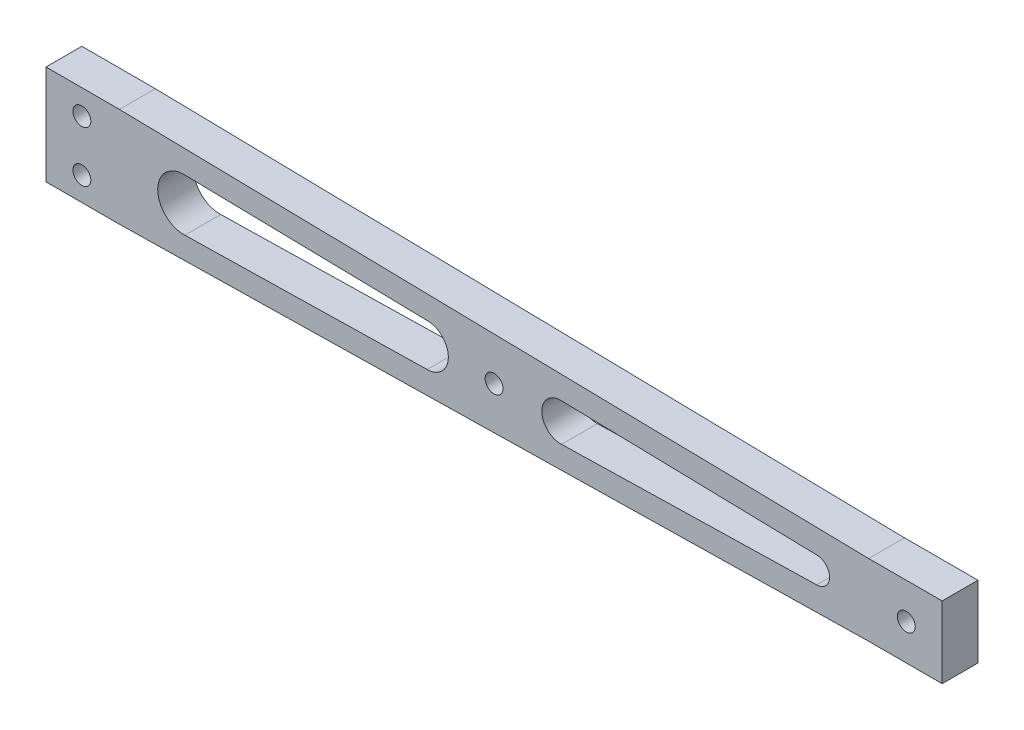
ISO-10303-21;
HEADER;
FILE_DESCRIPTION(('STEP AP214'),'2;1');
FILE_NAME('part.step','',(''),(''),'','','');
FILE_SCHEMA(('AUTOMOTIVE_DESIGN { 1 0 10303 214 1 1 1 1 }'));
ENDSEC;
DATA;
#1=APPLICATION_CONTEXT('core data for automotive mechanical design processes');
#2=APPLICATION_PROTOCOL_DEFINITION('international standard','automotive_design',2000,#1);
#3=PRODUCT_CONTEXT('',#1,'mechanical');
#4=PRODUCT('Part','Part','',(#3));
#5=PRODUCT_RELATED_PRODUCT_CATEGORY('part','',(#4));
#6=PRODUCT_DEFINITION_FORMATION('','',#4);
#7=PRODUCT_DEFINITION_CONTEXT('part definition',#1,'design');
#8=PRODUCT_DEFINITION('design','',#6,#7);
#9=PRODUCT_DEFINITION_SHAPE('','',#8);
#10=(LENGTH_UNIT() NAMED_UNIT(*) SI_UNIT(.MILLI.,.METRE.));
#11=(NAMED_UNIT(*) PLANE_ANGLE_UNIT() SI_UNIT($,.RADIAN.));
#12=(NAMED_UNIT(*) SI_UNIT($,.STERADIAN.) SOLID_ANGLE_UNIT());
#13=UNCERTAINTY_MEASURE_WITH_UNIT(LENGTH_MEASURE(1.E-05),#10,'distance_accuracy_value','');
#14=(GEOMETRIC_REPRESENTATION_CONTEXT(3) GLOBAL_UNCERTAINTY_ASSIGNED_CONTEXT((#13)) GLOBAL_UNIT_ASSIGNED_CONTEXT((#10,
#11,#12)) REPRESENTATION_CONTEXT('',''));
#15=CARTESIAN_POINT('',(0.,0.,0.));
#16=DIRECTION('',(0.,0.,1.));
#17=DIRECTION('',(1.,0.,0.));
#18=AXIS2_PLACEMENT_3D('',#15,#16,#17);
#19=CARTESIAN_POINT('',(0.,0.,10.));
#20=DIRECTION('',(0.,0.,1.));
#21=DIRECTION('',(1.,0.,0.));
#22=AXIS2_PLACEMENT_3D('',#19,#20,#21);
#23=PLANE('',#22);
#24=CARTESIAN_POINT('',(10.0736692158936,2.87880970195048,10.));
#25=DIRECTION('',(0.,0.,1.));
#26=DIRECTION('',(1.,0.,0.));
#27=AXIS2_PLACEMENT_3D('',#24,#25,#26);
#28=CIRCLE('',#27,2.5);
#29=CARTESIAN_POINT('',(12.5736692158936,2.87880970195048,10.));
#30=VERTEX_POINT('',#29);
#31=EDGE_CURVE('E255',#30,#30,#28,.T.);
#32=ORIENTED_EDGE('',*,*,#31,.F.);
#33=EDGE_LOOP('',(#32));
#34=FACE_BOUND('',#33,.T.);
#35=CARTESIAN_POINT('',(10.0736692158936,17.1211902980495,10.));
#36=DIRECTION('',(0.,0.,1.));
#37=DIRECTION('',(1.,0.,0.));
#38=AXIS2_PLACEMENT_3D('',#35,#36,#37);
#39=CIRCLE('',#38,2.50000000000001);
#40=CARTESIAN_POINT('',(12.5736692158936,17.1211902980495,10.));
#41=VERTEX_POINT('',#40);
#42=EDGE_CURVE('E271',#41,#41,#39,.T.);
#43=ORIENTED_EDGE('',*,*,#42,.F.);
#44=EDGE_LOOP('',(#43));
#45=FACE_BOUND('',#44,.T.);
#46=DIRECTION('',(-1.,0.,0.));
#47=VECTOR('',#46,1.);
#48=CARTESIAN_POINT('',(250.073669215894,20.,10.));
#49=LINE('',#48,#47);
#50=CARTESIAN_POINT('',(250.073669215894,20.,10.));
#51=VERTEX_POINT('',#50);
#52=CARTESIAN_POINT('',(229.573669215894,20.,10.));
#53=VERTEX_POINT('',#52);
#54=EDGE_CURVE('E279',#51,#53,#49,.T.);
#55=ORIENTED_EDGE('',*,*,#54,.T.);
#56=DIRECTION('',(-0.99981690430808,0.0191352517570925,0.));
#57=VECTOR('',#56,1.);
#58=CARTESIAN_POINT('',(229.573669215894,20.,10.));
#59=LINE('',#58,#57);
#60=CARTESIAN_POINT('',(20.5736692158936,24.,10.));
#61=VERTEX_POINT('',#60);
#62=EDGE_CURVE('E283',#53,#61,#59,.T.);
#63=ORIENTED_EDGE('',*,*,#62,.T.);
#64=DIRECTION('',(-1.,0.,0.));
#65=VECTOR('',#64,1.);
#66=CARTESIAN_POINT('',(0.0736692158935792,24.,10.));
#67=LINE('',#66,#65);
#68=CARTESIAN_POINT('',(0.0736692158935792,24.,10.));
#69=VERTEX_POINT('',#68);
#70=EDGE_CURVE('E287',#61,#69,#67,.T.);
#71=ORIENTED_EDGE('',*,*,#70,.T.);
#72=DIRECTION('',(0.,-1.,0.));
#73=VECTOR('',#72,1.);
#74=CARTESIAN_POINT('',(0.0736692158935792,24.,10.));
#75=LINE('',#74,#73);
#76=CARTESIAN_POINT('',(0.0736692158935792,-3.75761940390097,10.));
#77=VERTEX_POINT('',#76);
#78=EDGE_CURVE('E290',#69,#77,#75,.T.);
#79=ORIENTED_EDGE('',*,*,#78,.T.);
#80=DIRECTION('',(1.,0.,0.));
#81=VECTOR('',#80,1.);
#82=CARTESIAN_POINT('',(0.0736692158935792,-3.75761940390097,10.));
#83=LINE('',#82,#81);
#84=CARTESIAN_POINT('',(20.5736692158936,-3.75761940390097,10.));
#85=VERTEX_POINT('',#84);
#86=EDGE_CURVE('E293',#77,#85,#83,.T.);
#87=ORIENTED_EDGE('',*,*,#86,.T.);
#88=DIRECTION('',(0.999838416228975,0.0179761350889359,0.));
#89=VECTOR('',#88,1.);
#90=CARTESIAN_POINT('',(229.573669215894,0.,10.));
#91=LINE('',#90,#89);
#92=CARTESIAN_POINT('',(229.573669215894,0.,10.));
#93=VERTEX_POINT('',#92);
#94=EDGE_CURVE('E296',#85,#93,#91,.T.);
#95=ORIENTED_EDGE('',*,*,#94,.T.);
#96=DIRECTION('',(1.,0.,0.));
#97=VECTOR('',#96,1.);
#98=CARTESIAN_POINT('',(250.073669215894,0.,10.));
#99=LINE('',#98,#97);
#100=CARTESIAN_POINT('',(250.073669215894,0.,10.));
#101=VERTEX_POINT('',#100);
#102=EDGE_CURVE('E299',#93,#101,#99,.T.);
#103=ORIENTED_EDGE('',*,*,#102,.T.);
#104=DIRECTION('',(0.,1.,0.));
#105=VECTOR('',#104,1.);
#106=CARTESIAN_POINT('',(250.073669215894,0.,10.));
#107=LINE('',#106,#105);
#108=EDGE_CURVE('E302',#101,#51,#107,.T.);
#109=ORIENTED_EDGE('',*,*,#108,.T.);
#110=EDGE_LOOP('',(#55,#63,#71,#79,#87,#95,#103,#109));
#111=FACE_BOUND('',#110,.T.);
#112=CARTESIAN_POINT('',(240.073669215894,9.99999999999999,10.));
#113=DIRECTION('',(0.,0.,1.));
#114=DIRECTION('',(1.,0.,0.));
#115=AXIS2_PLACEMENT_3D('',#112,#113,#114);
#116=CIRCLE('',#115,2.49999999999997);
#117=CARTESIAN_POINT('',(242.573669215894,9.99999999999999,10.));
#118=VERTEX_POINT('',#117);
#119=EDGE_CURVE('E263',#118,#118,#116,.T.);
#120=ORIENTED_EDGE('',*,*,#119,.F.);
#121=EDGE_LOOP('',(#120));
#122=FACE_BOUND('',#121,.T.);
#123=CARTESIAN_POINT('',(125.073669215894,9.99999999999999,10.));
#124=DIRECTION('',(0.,0.,1.));
#125=DIRECTION('',(1.,0.,0.));
#126=AXIS2_PLACEMENT_3D('',#123,#124,#125);
#127=CIRCLE('',#126,2.5);
#128=CARTESIAN_POINT('',(127.573669215894,9.99999999999999,10.));
#129=VERTEX_POINT('',#128);
#130=EDGE_CURVE('E247',#129,#129,#127,.T.);
#131=ORIENTED_EDGE('',*,*,#130,.F.);
#132=EDGE_LOOP('',(#131));
#133=FACE_BOUND('',#132,.T.);
#134=DIRECTION('',(-0.999735231647633,0.0230101412958051,0.));
#135=VECTOR('',#134,1.);
#136=CARTESIAN_POINT('',(215.057391590828,13.6211902980495,10.));
#137=LINE('',#136,#135);
#138=CARTESIAN_POINT('',(215.057391590828,13.6211902980495,10.));
#139=VERTEX_POINT('',#138);
#140=CARTESIAN_POINT('',(143.897703928752,15.2590184107701,10.));
#141=VERTEX_POINT('',#140);
#142=EDGE_CURVE('E207',#139,#141,#137,.T.);
#143=ORIENTED_EDGE('',*,*,#142,.F.);
#144=CARTESIAN_POINT('',(215.057391590828,9.99999999999999,10.));
#145=DIRECTION('',(0.,0.,1.));
#146=DIRECTION('',(1.,0.,0.));
#147=AXIS2_PLACEMENT_3D('',#144,#145,#146);
#148=CIRCLE('',#147,3.62119029804952);
#149=CARTESIAN_POINT('',(215.057391590828,6.37880970195047,10.));
#150=VERTEX_POINT('',#149);
#151=EDGE_CURVE('E204',#150,#139,#148,.T.);
#152=ORIENTED_EDGE('',*,*,#151,.F.);
#153=DIRECTION('',(0.999735231647633,0.0230101412958052,0.));
#154=VECTOR('',#153,1.);
#155=CARTESIAN_POINT('',(143.897703928752,4.74098158922988,10.));
#156=LINE('',#155,#154);
#157=CARTESIAN_POINT('',(143.897703928752,4.74098158922988,10.));
#158=VERTEX_POINT('',#157);
#159=EDGE_CURVE('E215',#158,#150,#156,.T.);
#160=ORIENTED_EDGE('',*,*,#159,.F.);
#161=CARTESIAN_POINT('',(143.655490006606,9.99999999999999,10.));
#162=DIRECTION('',(0.,0.,1.));
#163=DIRECTION('',(1.,0.,0.));
#164=AXIS2_PLACEMENT_3D('',#161,#162,#163);
#165=CIRCLE('',#164,5.26459326338704);
#166=EDGE_CURVE('E211',#141,#158,#165,.T.);
#167=ORIENTED_EDGE('',*,*,#166,.F.);
#168=EDGE_LOOP('',(#143,#152,#160,#167));
#169=FACE_BOUND('',#168,.T.);
#170=DIRECTION('',(0.999798789214008,0.0200594388307592,0.));
#171=VECTOR('',#170,1.);
#172=CARTESIAN_POINT('',(38.8063004269599,2.72936201454865,10.));
#173=LINE('',#172,#171);
#174=CARTESIAN_POINT('',(38.8063004269599,2.72936201454865,10.));
#175=VERTEX_POINT('',#174);
#176=CARTESIAN_POINT('',(106.398152107808,4.08548949627487,10.));
#177=VERTEX_POINT('',#176);
#178=EDGE_CURVE('E164',#175,#177,#173,.T.);
#179=ORIENTED_EDGE('',*,*,#178,.F.);
#180=CARTESIAN_POINT('',(38.5144343995034,9.99999999999998,10.));
#181=DIRECTION('',(0.,0.,1.));
#182=DIRECTION('',(1.,0.,0.));
#183=AXIS2_PLACEMENT_3D('',#180,#181,#182);
#184=CIRCLE('',#183,7.27649383243544);
#185=CARTESIAN_POINT('',(38.8063004269601,17.2706379854513,10.));
#186=VERTEX_POINT('',#185);
#187=EDGE_CURVE('E155',#186,#175,#184,.T.);
#188=ORIENTED_EDGE('',*,*,#187,.F.);
#189=DIRECTION('',(-0.999798789214007,0.020059438830759,0.));
#190=VECTOR('',#189,1.);
#191=CARTESIAN_POINT('',(106.398152107808,15.9145105037251,10.));
#192=LINE('',#191,#190);
#193=CARTESIAN_POINT('',(106.398152107808,15.9145105037251,10.));
#194=VERTEX_POINT('',#193);
#195=EDGE_CURVE('E182',#194,#186,#192,.T.);
#196=ORIENTED_EDGE('',*,*,#195,.F.);
#197=CARTESIAN_POINT('',(106.398152107808,9.99999999999998,10.));
#198=DIRECTION('',(0.,0.,1.));
#199=DIRECTION('',(1.,0.,0.));
#200=AXIS2_PLACEMENT_3D('',#197,#198,#199);
#201=CIRCLE('',#200,5.91451050372511);
#202=EDGE_CURVE('E177',#177,#194,#201,.T.);
#203=ORIENTED_EDGE('',*,*,#202,.F.);
#204=EDGE_LOOP('',(#179,#188,#196,#203));
#205=FACE_BOUND('',#204,.T.);
#206=ADVANCED_FACE('F41',(#34,#45,#111,#122,#133,#169,#205),#23,.T.);
#207=CARTESIAN_POINT('',(0.,0.,0.));
#208=DIRECTION('',(0.,0.,1.));
#209=DIRECTION('',(1.,0.,0.));
#210=AXIS2_PLACEMENT_3D('',#207,#208,#209);
#211=PLANE('',#210);
#212=CARTESIAN_POINT('',(215.057391590828,9.99999999999999,0.));
#213=DIRECTION('',(0.,0.,1.));
#214=DIRECTION('',(1.,0.,0.));
#215=AXIS2_PLACEMENT_3D('',#212,#213,#214);
#216=CIRCLE('',#215,3.62119029804952);
#217=CARTESIAN_POINT('',(215.057391590828,6.37880970195047,0.));
#218=VERTEX_POINT('',#217);
#219=CARTESIAN_POINT('',(215.057391590828,13.6211902980495,0.));
#220=VERTEX_POINT('',#219);
#221=EDGE_CURVE('E173',#218,#220,#216,.T.);
#222=ORIENTED_EDGE('',*,*,#221,.T.);
#223=DIRECTION('',(-0.999735231647633,0.0230101412958051,0.));
#224=VECTOR('',#223,1.);
#225=CARTESIAN_POINT('',(215.057391590828,13.6211902980495,0.));
#226=LINE('',#225,#224);
#227=CARTESIAN_POINT('',(143.897703928752,15.2590184107701,0.));
#228=VERTEX_POINT('',#227);
#229=EDGE_CURVE('E222',#220,#228,#226,.T.);
#230=ORIENTED_EDGE('',*,*,#229,.T.);
#231=CARTESIAN_POINT('',(143.655490006606,9.99999999999999,0.));
#232=DIRECTION('',(0.,0.,1.));
#233=DIRECTION('',(1.,0.,0.));
#234=AXIS2_PLACEMENT_3D('',#231,#232,#233);
#235=CIRCLE('',#234,5.26459326338704);
#236=CARTESIAN_POINT('',(143.897703928752,4.74098158922988,0.));
#237=VERTEX_POINT('',#236);
#238=EDGE_CURVE('E226',#228,#237,#235,.T.);
#239=ORIENTED_EDGE('',*,*,#238,.T.);
#240=DIRECTION('',(0.999735231647633,0.0230101412958052,0.));
#241=VECTOR('',#240,1.);
#242=CARTESIAN_POINT('',(143.897703928752,4.74098158922988,0.));
#243=LINE('',#242,#241);
#244=EDGE_CURVE('E208',#237,#218,#243,.T.);
#245=ORIENTED_EDGE('',*,*,#244,.T.);
#246=EDGE_LOOP('',(#222,#230,#239,#245));
#247=FACE_BOUND('',#246,.T.);
#248=DIRECTION('',(-1.,0.,0.));
#249=VECTOR('',#248,1.);
#250=CARTESIAN_POINT('',(250.073669215894,20.,0.));
#251=LINE('',#250,#249);
#252=CARTESIAN_POINT('',(250.073669215894,20.,0.));
#253=VERTEX_POINT('',#252);
#254=CARTESIAN_POINT('',(229.573669215894,20.,0.));
#255=VERTEX_POINT('',#254);
#256=EDGE_CURVE('E275',#253,#255,#251,.T.);
#257=ORIENTED_EDGE('',*,*,#256,.F.);
#258=DIRECTION('',(0.,1.,0.));
#259=VECTOR('',#258,1.);
#260=CARTESIAN_POINT('',(250.073669215894,0.,0.));
#261=LINE('',#260,#259);
#262=CARTESIAN_POINT('',(250.073669215894,0.,0.));
#263=VERTEX_POINT('',#262);
#264=EDGE_CURVE('E284',#263,#253,#261,.T.);
#265=ORIENTED_EDGE('',*,*,#264,.F.);
#266=DIRECTION('',(1.,0.,0.));
#267=VECTOR('',#266,1.);
#268=CARTESIAN_POINT('',(250.073669215894,0.,0.));
#269=LINE('',#268,#267);
#270=CARTESIAN_POINT('',(229.573669215894,0.,0.));
#271=VERTEX_POINT('',#270);
#272=EDGE_CURVE('E324',#271,#263,#269,.T.);
#273=ORIENTED_EDGE('',*,*,#272,.F.);
#274=DIRECTION('',(0.999838416228975,0.0179761350889359,0.));
#275=VECTOR('',#274,1.);
#276=CARTESIAN_POINT('',(229.573669215894,0.,0.));
#277=LINE('',#276,#275);
#278=CARTESIAN_POINT('',(20.5736692158936,-3.75761940390097,0.));
#279=VERTEX_POINT('',#278);
#280=EDGE_CURVE('E321',#279,#271,#277,.T.);
#281=ORIENTED_EDGE('',*,*,#280,.F.);
#282=DIRECTION('',(1.,0.,0.));
#283=VECTOR('',#282,1.);
#284=CARTESIAN_POINT('',(0.0736692158935792,-3.75761940390097,0.));
#285=LINE('',#284,#283);
#286=CARTESIAN_POINT('',(0.0736692158935792,-3.75761940390097,0.));
#287=VERTEX_POINT('',#286);
#288=EDGE_CURVE('E318',#287,#279,#285,.T.);
#289=ORIENTED_EDGE('',*,*,#288,.F.);
#290=DIRECTION('',(0.,-1.,0.));
#291=VECTOR('',#290,1.);
#292=CARTESIAN_POINT('',(0.0736692158935792,24.,0.));
#293=LINE('',#292,#291);
#294=CARTESIAN_POINT('',(0.0736692158935792,24.,0.));
#295=VERTEX_POINT('',#294);
#296=EDGE_CURVE('E315',#295,#287,#293,.T.);
#297=ORIENTED_EDGE('',*,*,#296,.F.);
#298=DIRECTION('',(-1.,0.,0.));
#299=VECTOR('',#298,1.);
#300=CARTESIAN_POINT('',(0.0736692158935792,24.,0.));
#301=LINE('',#300,#299);
#302=CARTESIAN_POINT('',(20.5736692158936,24.,0.));
#303=VERTEX_POINT('',#302);
#304=EDGE_CURVE('E312',#303,#295,#301,.T.);
#305=ORIENTED_EDGE('',*,*,#304,.F.);
#306=DIRECTION('',(-0.99981690430808,0.0191352517570925,0.));
#307=VECTOR('',#306,1.);
#308=CARTESIAN_POINT('',(229.573669215894,20.,0.));
#309=LINE('',#308,#307);
#310=EDGE_CURVE('E309',#255,#303,#309,.T.);
#311=ORIENTED_EDGE('',*,*,#310,.F.);
#312=EDGE_LOOP('',(#257,#265,#273,#281,#289,#297,#305,#311));
#313=FACE_BOUND('',#312,.T.);
#314=CARTESIAN_POINT('',(10.0736692158936,17.1211902980495,0.));
#315=DIRECTION('',(0.,0.,1.));
#316=DIRECTION('',(1.,0.,0.));
#317=AXIS2_PLACEMENT_3D('',#314,#315,#316);
#318=CIRCLE('',#317,2.50000000000001);
#319=CARTESIAN_POINT('',(12.5736692158936,17.1211902980495,0.));
#320=VERTEX_POINT('',#319);
#321=EDGE_CURVE('E267',#320,#320,#318,.T.);
#322=ORIENTED_EDGE('',*,*,#321,.T.);
#323=EDGE_LOOP('',(#322));
#324=FACE_BOUND('',#323,.T.);
#325=CARTESIAN_POINT('',(240.073669215894,9.99999999999999,0.));
#326=DIRECTION('',(0.,0.,1.));
#327=DIRECTION('',(1.,0.,0.));
#328=AXIS2_PLACEMENT_3D('',#325,#326,#327);
#329=CIRCLE('',#328,2.49999999999997);
#330=CARTESIAN_POINT('',(242.573669215894,9.99999999999999,0.));
#331=VERTEX_POINT('',#330);
#332=EDGE_CURVE('E259',#331,#331,#329,.T.);
#333=ORIENTED_EDGE('',*,*,#332,.T.);
#334=EDGE_LOOP('',(#333));
#335=FACE_BOUND('',#334,.T.);
#336=CARTESIAN_POINT('',(10.0736692158936,2.87880970195048,0.));
#337=DIRECTION('',(0.,0.,1.));
#338=DIRECTION('',(1.,0.,0.));
#339=AXIS2_PLACEMENT_3D('',#336,#337,#338);
#340=CIRCLE('',#339,2.5);
#341=CARTESIAN_POINT('',(12.5736692158936,2.87880970195048,0.));
#342=VERTEX_POINT('',#341);
#343=EDGE_CURVE('E251',#342,#342,#340,.T.);
#344=ORIENTED_EDGE('',*,*,#343,.T.);
#345=EDGE_LOOP('',(#344));
#346=FACE_BOUND('',#345,.T.);
#347=CARTESIAN_POINT('',(125.073669215894,9.99999999999999,0.));
#348=DIRECTION('',(0.,0.,1.));
#349=DIRECTION('',(1.,0.,0.));
#350=AXIS2_PLACEMENT_3D('',#347,#348,#349);
#351=CIRCLE('',#350,2.5);
#352=CARTESIAN_POINT('',(127.573669215894,9.99999999999999,0.));
#353=VERTEX_POINT('',#352);
#354=EDGE_CURVE('E246',#353,#353,#351,.T.);
#355=ORIENTED_EDGE('',*,*,#354,.T.);
#356=EDGE_LOOP('',(#355));
#357=FACE_BOUND('',#356,.T.);
#358=CARTESIAN_POINT('',(38.5144343995034,9.99999999999998,0.));
#359=DIRECTION('',(0.,0.,1.));
#360=DIRECTION('',(1.,0.,0.));
#361=AXIS2_PLACEMENT_3D('',#358,#359,#360);
#362=CIRCLE('',#361,7.27649383243544);
#363=CARTESIAN_POINT('',(38.8063004269601,17.2706379854513,0.));
#364=VERTEX_POINT('',#363);
#365=CARTESIAN_POINT('',(38.8063004269599,2.72936201454865,0.));
#366=VERTEX_POINT('',#365);
#367=EDGE_CURVE('E65',#364,#366,#362,.T.);
#368=ORIENTED_EDGE('',*,*,#367,.T.);
#369=DIRECTION('',(0.999798789214008,0.0200594388307592,0.));
#370=VECTOR('',#369,1.);
#371=CARTESIAN_POINT('',(38.8063004269599,2.72936201454865,0.));
#372=LINE('',#371,#370);
#373=CARTESIAN_POINT('',(106.398152107808,4.08548949627487,0.));
#374=VERTEX_POINT('',#373);
#375=EDGE_CURVE('E171',#366,#374,#372,.T.);
#376=ORIENTED_EDGE('',*,*,#375,.T.);
#377=CARTESIAN_POINT('',(106.398152107808,9.99999999999998,0.));
#378=DIRECTION('',(0.,0.,1.));
#379=DIRECTION('',(1.,0.,0.));
#380=AXIS2_PLACEMENT_3D('',#377,#378,#379);
#381=CIRCLE('',#380,5.91451050372511);
#382=CARTESIAN_POINT('',(106.398152107808,15.9145105037251,0.));
#383=VERTEX_POINT('',#382);
#384=EDGE_CURVE('E191',#374,#383,#381,.T.);
#385=ORIENTED_EDGE('',*,*,#384,.T.);
#386=DIRECTION('',(-0.999798789214007,0.020059438830759,0.));
#387=VECTOR('',#386,1.);
#388=CARTESIAN_POINT('',(106.398152107808,15.9145105037251,0.));
#389=LINE('',#388,#387);
#390=EDGE_CURVE('E165',#383,#364,#389,.T.);
#391=ORIENTED_EDGE('',*,*,#390,.T.);
#392=EDGE_LOOP('',(#368,#376,#385,#391));
#393=FACE_BOUND('',#392,.T.);
#394=ADVANCED_FACE('F364',(#247,#313,#324,#335,#346,#357,#393),#211,.F.);
#395=CARTESIAN_POINT('',(250.073669215894,20.,10.));
#396=DIRECTION('',(0.,-1.,0.));
#397=DIRECTION('',(0.,0.,-1.));
#398=AXIS2_PLACEMENT_3D('',#395,#396,#397);
#399=PLANE('',#398);
#400=ORIENTED_EDGE('',*,*,#256,.T.);
#401=DIRECTION('',(0.,0.,-1.));
#402=VECTOR('',#401,1.);
#403=CARTESIAN_POINT('',(229.573669215894,20.,10.));
#404=LINE('',#403,#402);
#405=EDGE_CURVE('E11',#53,#255,#404,.T.);
#406=ORIENTED_EDGE('',*,*,#405,.F.);
#407=ORIENTED_EDGE('',*,*,#54,.F.);
#408=DIRECTION('',(0.,0.,-1.));
#409=VECTOR('',#408,1.);
#410=CARTESIAN_POINT('',(250.073669215894,20.,10.));
#411=LINE('',#410,#409);
#412=EDGE_CURVE('E305',#51,#253,#411,.T.);
#413=ORIENTED_EDGE('',*,*,#412,.T.);
#414=EDGE_LOOP('',(#400,#406,#407,#413));
#415=FACE_BOUND('',#414,.T.);
#416=ADVANCED_FACE('F43',(#415),#399,.F.);
#417=CARTESIAN_POINT('',(229.573669215894,20.,10.));
#418=DIRECTION('',(-0.0191352517570925,-0.99981690430808,0.));
#419=DIRECTION('',(0.99981690430808,-0.0191352517570925,0.));
#420=AXIS2_PLACEMENT_3D('',#417,#418,#419);
#421=PLANE('',#420);
#422=ORIENTED_EDGE('',*,*,#310,.T.);
#423=DIRECTION('',(0.,0.,-1.));
#424=VECTOR('',#423,1.);
#425=CARTESIAN_POINT('',(20.5736692158936,24.,10.));
#426=LINE('',#425,#424);
#427=EDGE_CURVE('E50',#61,#303,#426,.T.);
#428=ORIENTED_EDGE('',*,*,#427,.F.);
#429=ORIENTED_EDGE('',*,*,#62,.F.);
#430=ORIENTED_EDGE('',*,*,#405,.T.);
#431=EDGE_LOOP('',(#422,#428,#429,#430));
#432=FACE_BOUND('',#431,.T.);
#433=ADVANCED_FACE('F382',(#432),#421,.F.);
#434=CARTESIAN_POINT('',(0.0736692158935792,24.,10.));
#435=DIRECTION('',(0.,-1.,0.));
#436=DIRECTION('',(0.,0.,-1.));
#437=AXIS2_PLACEMENT_3D('',#434,#435,#436);
#438=PLANE('',#437);
#439=ORIENTED_EDGE('',*,*,#304,.T.);
#440=DIRECTION('',(0.,0.,-1.));
#441=VECTOR('',#440,1.);
#442=CARTESIAN_POINT('',(0.0736692158935792,24.,10.));
#443=LINE('',#442,#441);
#444=EDGE_CURVE('E348',#69,#295,#443,.T.);
#445=ORIENTED_EDGE('',*,*,#444,.F.);
#446=ORIENTED_EDGE('',*,*,#70,.F.);
#447=ORIENTED_EDGE('',*,*,#427,.T.);
#448=EDGE_LOOP('',(#439,#445,#446,#447));
#449=FACE_BOUND('',#448,.T.);
#450=ADVANCED_FACE('F358',(#449),#438,.F.);
#451=CARTESIAN_POINT('',(0.0736692158935792,24.,10.));
#452=DIRECTION('',(1.,0.,0.));
#453=DIRECTION('',(0.,0.,-1.));
#454=AXIS2_PLACEMENT_3D('',#451,#452,#453);
#455=PLANE('',#454);
#456=ORIENTED_EDGE('',*,*,#296,.T.);
#457=DIRECTION('',(0.,0.,-1.));
#458=VECTOR('',#457,1.);
#459=CARTESIAN_POINT('',(0.0736692158935792,-3.75761940390097,10.));
#460=LINE('',#459,#458);
#461=EDGE_CURVE('E344',#77,#287,#460,.T.);
#462=ORIENTED_EDGE('',*,*,#461,.F.);
#463=ORIENTED_EDGE('',*,*,#78,.F.);
#464=ORIENTED_EDGE('',*,*,#444,.T.);
#465=EDGE_LOOP('',(#456,#462,#463,#464));
#466=FACE_BOUND('',#465,.T.);
#467=ADVANCED_FACE('F370',(#466),#455,.F.);
#468=CARTESIAN_POINT('',(0.0736692158935792,-3.75761940390097,10.));
#469=DIRECTION('',(0.,1.,0.));
#470=DIRECTION('',(0.,0.,1.));
#471=AXIS2_PLACEMENT_3D('',#468,#469,#470);
#472=PLANE('',#471);
#473=ORIENTED_EDGE('',*,*,#288,.T.);
#474=DIRECTION('',(0.,0.,-1.));
#475=VECTOR('',#474,1.);
#476=CARTESIAN_POINT('',(20.5736692158936,-3.75761940390097,10.));
#477=LINE('',#476,#475);
#478=EDGE_CURVE('E340',#85,#279,#477,.T.);
#479=ORIENTED_EDGE('',*,*,#478,.F.);
#480=ORIENTED_EDGE('',*,*,#86,.F.);
#481=ORIENTED_EDGE('',*,*,#461,.T.);
#482=EDGE_LOOP('',(#473,#479,#480,#481));
#483=FACE_BOUND('',#482,.T.);
#484=ADVANCED_FACE('F374',(#483),#472,.F.);
#485=CARTESIAN_POINT('',(229.573669215894,0.,10.));
#486=DIRECTION('',(-0.0179761350889359,0.999838416228975,0.));
#487=DIRECTION('',(-0.999838416228975,-0.0179761350889359,0.));
#488=AXIS2_PLACEMENT_3D('',#485,#486,#487);
#489=PLANE('',#488);
#490=ORIENTED_EDGE('',*,*,#280,.T.);
#491=DIRECTION('',(0.,0.,-1.));
#492=VECTOR('',#491,1.);
#493=CARTESIAN_POINT('',(229.573669215894,0.,10.));
#494=LINE('',#493,#492);
#495=EDGE_CURVE('E336',#93,#271,#494,.T.);
#496=ORIENTED_EDGE('',*,*,#495,.F.);
#497=ORIENTED_EDGE('',*,*,#94,.F.);
#498=ORIENTED_EDGE('',*,*,#478,.T.);
#499=EDGE_LOOP('',(#490,#496,#497,#498));
#500=FACE_BOUND('',#499,.T.);
#501=ADVANCED_FACE('F395',(#500),#489,.F.);
#502=CARTESIAN_POINT('',(250.073669215894,0.,10.));
#503=DIRECTION('',(0.,1.,0.));
#504=DIRECTION('',(-1.,0.,0.));
#505=AXIS2_PLACEMENT_3D('',#502,#503,#504);
#506=PLANE('',#505);
#507=ORIENTED_EDGE('',*,*,#272,.T.);
#508=DIRECTION('',(0.,0.,-1.));
#509=VECTOR('',#508,1.);
#510=CARTESIAN_POINT('',(250.073669215894,0.,10.));
#511=LINE('',#510,#509);
#512=EDGE_CURVE('E332',#101,#263,#511,.T.);
#513=ORIENTED_EDGE('',*,*,#512,.F.);
#514=ORIENTED_EDGE('',*,*,#102,.F.);
#515=ORIENTED_EDGE('',*,*,#495,.T.);
#516=EDGE_LOOP('',(#507,#513,#514,#515));
#517=FACE_BOUND('',#516,.T.);
#518=ADVANCED_FACE('F393',(#517),#506,.F.);
#519=CARTESIAN_POINT('',(250.073669215894,0.,10.));
#520=DIRECTION('',(-1.,0.,0.));
#521=DIRECTION('',(0.,0.,1.));
#522=AXIS2_PLACEMENT_3D('',#519,#520,#521);
#523=PLANE('',#522);
#524=ORIENTED_EDGE('',*,*,#264,.T.);
#525=ORIENTED_EDGE('',*,*,#412,.F.);
#526=ORIENTED_EDGE('',*,*,#108,.F.);
#527=ORIENTED_EDGE('',*,*,#512,.T.);
#528=EDGE_LOOP('',(#524,#525,#526,#527));
#529=FACE_BOUND('',#528,.T.);
#530=ADVANCED_FACE('F388',(#529),#523,.F.);
#531=CARTESIAN_POINT('',(10.0736692158936,17.1211902980495,10.));
#532=DIRECTION('',(0.,0.,-1.));
#533=DIRECTION('',(-1.,0.,0.));
#534=AXIS2_PLACEMENT_3D('',#531,#532,#533);
#535=CYLINDRICAL_SURFACE('',#534,2.50000000000001);
#536=ORIENTED_EDGE('',*,*,#42,.T.);
#537=EDGE_LOOP('',(#536));
#538=FACE_BOUND('',#537,.T.);
#539=ORIENTED_EDGE('',*,*,#321,.F.);
#540=EDGE_LOOP('',(#539));
#541=FACE_BOUND('',#540,.T.);
#542=ADVANCED_FACE('F415',(#538,#541),#535,.F.);
#543=CARTESIAN_POINT('',(240.073669215894,9.99999999999999,10.));
#544=DIRECTION('',(0.,0.,-1.));
#545=DIRECTION('',(-1.,0.,0.));
#546=AXIS2_PLACEMENT_3D('',#543,#544,#545);
#547=CYLINDRICAL_SURFACE('',#546,2.49999999999997);
#548=ORIENTED_EDGE('',*,*,#119,.T.);
#549=EDGE_LOOP('',(#548));
#550=FACE_BOUND('',#549,.T.);
#551=ORIENTED_EDGE('',*,*,#332,.F.);
#552=EDGE_LOOP('',(#551));
#553=FACE_BOUND('',#552,.T.);
#554=ADVANCED_FACE('F422',(#550,#553),#547,.F.);
#555=CARTESIAN_POINT('',(10.0736692158936,2.87880970195048,10.));
#556=DIRECTION('',(0.,0.,-1.));
#557=DIRECTION('',(-1.,0.,0.));
#558=AXIS2_PLACEMENT_3D('',#555,#556,#557);
#559=CYLINDRICAL_SURFACE('',#558,2.5);
#560=ORIENTED_EDGE('',*,*,#31,.T.);
#561=EDGE_LOOP('',(#560));
#562=FACE_BOUND('',#561,.T.);
#563=ORIENTED_EDGE('',*,*,#343,.F.);
#564=EDGE_LOOP('',(#563));
#565=FACE_BOUND('',#564,.T.);
#566=ADVANCED_FACE('F427',(#562,#565),#559,.F.);
#567=CARTESIAN_POINT('',(125.073669215894,9.99999999999999,10.));
#568=DIRECTION('',(0.,0.,-1.));
#569=DIRECTION('',(-1.,0.,0.));
#570=AXIS2_PLACEMENT_3D('',#567,#568,#569);
#571=CYLINDRICAL_SURFACE('',#570,2.5);
#572=ORIENTED_EDGE('',*,*,#130,.T.);
#573=EDGE_LOOP('',(#572));
#574=FACE_BOUND('',#573,.T.);
#575=ORIENTED_EDGE('',*,*,#354,.F.);
#576=EDGE_LOOP('',(#575));
#577=FACE_BOUND('',#576,.T.);
#578=ADVANCED_FACE('F469',(#574,#577),#571,.F.);
#579=CARTESIAN_POINT('',(215.057391590828,9.99999999999999,10.));
#580=DIRECTION('',(0.,0.,-1.));
#581=DIRECTION('',(-1.,0.,0.));
#582=AXIS2_PLACEMENT_3D('',#579,#580,#581);
#583=CYLINDRICAL_SURFACE('',#582,3.62119029804952);
#584=ORIENTED_EDGE('',*,*,#221,.F.);
#585=DIRECTION('',(0.,0.,-1.));
#586=VECTOR('',#585,1.);
#587=CARTESIAN_POINT('',(215.057391590828,6.37880970195047,10.));
#588=LINE('',#587,#586);
#589=EDGE_CURVE('E218',#150,#218,#588,.T.);
#590=ORIENTED_EDGE('',*,*,#589,.F.);
#591=ORIENTED_EDGE('',*,*,#151,.T.);
#592=DIRECTION('',(0.,0.,-1.));
#593=VECTOR('',#592,1.);
#594=CARTESIAN_POINT('',(215.057391590828,13.6211902980495,10.));
#595=LINE('',#594,#593);
#596=EDGE_CURVE('E242',#139,#220,#595,.T.);
#597=ORIENTED_EDGE('',*,*,#596,.T.);
#598=EDGE_LOOP('',(#584,#590,#591,#597));
#599=FACE_BOUND('',#598,.T.);
#600=ADVANCED_FACE('F465',(#599),#583,.F.);
#601=CARTESIAN_POINT('',(215.057391590828,13.6211902980495,10.));
#602=DIRECTION('',(-0.0230101412958051,-0.999735231647633,0.));
#603=DIRECTION('',(0.999735231647633,-0.0230101412958051,0.));
#604=AXIS2_PLACEMENT_3D('',#601,#602,#603);
#605=PLANE('',#604);
#606=ORIENTED_EDGE('',*,*,#229,.F.);
#607=ORIENTED_EDGE('',*,*,#596,.F.);
#608=ORIENTED_EDGE('',*,*,#142,.T.);
#609=DIRECTION('',(0.,0.,-1.));
#610=VECTOR('',#609,1.);
#611=CARTESIAN_POINT('',(143.897703928752,15.2590184107701,10.));
#612=LINE('',#611,#610);
#613=EDGE_CURVE('E239',#141,#228,#612,.T.);
#614=ORIENTED_EDGE('',*,*,#613,.T.);
#615=EDGE_LOOP('',(#606,#607,#608,#614));
#616=FACE_BOUND('',#615,.T.);
#617=ADVANCED_FACE('F461',(#616),#605,.T.);
#618=CARTESIAN_POINT('',(143.655490006606,9.99999999999999,10.));
#619=DIRECTION('',(0.,0.,-1.));
#620=DIRECTION('',(-1.,0.,0.));
#621=AXIS2_PLACEMENT_3D('',#618,#619,#620);
#622=CYLINDRICAL_SURFACE('',#621,5.26459326338704);
#623=ORIENTED_EDGE('',*,*,#238,.F.);
#624=ORIENTED_EDGE('',*,*,#613,.F.);
#625=ORIENTED_EDGE('',*,*,#166,.T.);
#626=DIRECTION('',(0.,0.,-1.));
#627=VECTOR('',#626,1.);
#628=CARTESIAN_POINT('',(143.897703928752,4.74098158922988,10.));
#629=LINE('',#628,#627);
#630=EDGE_CURVE('E236',#158,#237,#629,.T.);
#631=ORIENTED_EDGE('',*,*,#630,.T.);
#632=EDGE_LOOP('',(#623,#624,#625,#631));
#633=FACE_BOUND('',#632,.T.);
#634=ADVANCED_FACE('F457',(#633),#622,.F.);
#635=CARTESIAN_POINT('',(143.897703928752,4.74098158922988,10.));
#636=DIRECTION('',(-0.0230101412958052,0.999735231647633,0.));
#637=DIRECTION('',(-0.999735231647633,-0.0230101412958052,0.));
#638=AXIS2_PLACEMENT_3D('',#635,#636,#637);
#639=PLANE('',#638);
#640=ORIENTED_EDGE('',*,*,#244,.F.);
#641=ORIENTED_EDGE('',*,*,#630,.F.);
#642=ORIENTED_EDGE('',*,*,#159,.T.);
#643=ORIENTED_EDGE('',*,*,#589,.T.);
#644=EDGE_LOOP('',(#640,#641,#642,#643));
#645=FACE_BOUND('',#644,.T.);
#646=ADVANCED_FACE('F454',(#645),#639,.T.);
#647=CARTESIAN_POINT('',(38.5144343995034,9.99999999999998,10.));
#648=DIRECTION('',(0.,0.,-1.));
#649=DIRECTION('',(-1.,0.,0.));
#650=AXIS2_PLACEMENT_3D('',#647,#648,#649);
#651=CYLINDRICAL_SURFACE('',#650,7.27649383243544);
#652=ORIENTED_EDGE('',*,*,#367,.F.);
#653=DIRECTION('',(0.,0.,-1.));
#654=VECTOR('',#653,1.);
#655=CARTESIAN_POINT('',(38.8063004269601,17.2706379854513,10.));
#656=LINE('',#655,#654);
#657=EDGE_CURVE('E159',#186,#364,#656,.T.);
#658=ORIENTED_EDGE('',*,*,#657,.F.);
#659=ORIENTED_EDGE('',*,*,#187,.T.);
#660=DIRECTION('',(0.,0.,-1.));
#661=VECTOR('',#660,1.);
#662=CARTESIAN_POINT('',(38.8063004269599,2.72936201454865,10.));
#663=LINE('',#662,#661);
#664=EDGE_CURVE('E158',#175,#366,#663,.T.);
#665=ORIENTED_EDGE('',*,*,#664,.T.);
#666=EDGE_LOOP('',(#652,#658,#659,#665));
#667=FACE_BOUND('',#666,.T.);
#668=ADVANCED_FACE('F157',(#667),#651,.F.);
#669=CARTESIAN_POINT('',(38.8063004269599,2.72936201454865,10.));
#670=DIRECTION('',(-0.0200594388307592,0.999798789214007,0.));
#671=DIRECTION('',(-0.999798789214007,-0.0200594388307592,0.));
#672=AXIS2_PLACEMENT_3D('',#669,#670,#671);
#673=PLANE('',#672);
#674=ORIENTED_EDGE('',*,*,#375,.F.);
#675=ORIENTED_EDGE('',*,*,#664,.F.);
#676=ORIENTED_EDGE('',*,*,#178,.T.);
#677=DIRECTION('',(0.,0.,-1.));
#678=VECTOR('',#677,1.);
#679=CARTESIAN_POINT('',(106.398152107808,4.08548949627487,10.));
#680=LINE('',#679,#678);
#681=EDGE_CURVE('E174',#177,#374,#680,.T.);
#682=ORIENTED_EDGE('',*,*,#681,.T.);
#683=EDGE_LOOP('',(#674,#675,#676,#682));
#684=FACE_BOUND('',#683,.T.);
#685=ADVANCED_FACE('F168',(#684),#673,.T.);
#686=CARTESIAN_POINT('',(106.398152107808,9.99999999999998,10.));
#687=DIRECTION('',(0.,0.,-1.));
#688=DIRECTION('',(-1.,0.,0.));
#689=AXIS2_PLACEMENT_3D('',#686,#687,#688);
#690=CYLINDRICAL_SURFACE('',#689,5.91451050372511);
#691=ORIENTED_EDGE('',*,*,#384,.F.);
#692=ORIENTED_EDGE('',*,*,#681,.F.);
#693=ORIENTED_EDGE('',*,*,#202,.T.);
#694=DIRECTION('',(0.,0.,-1.));
#695=VECTOR('',#694,1.);
#696=CARTESIAN_POINT('',(106.398152107808,15.9145105037251,10.));
#697=LINE('',#696,#695);
#698=EDGE_CURVE('E57',#194,#383,#697,.T.);
#699=ORIENTED_EDGE('',*,*,#698,.T.);
#700=EDGE_LOOP('',(#691,#692,#693,#699));
#701=FACE_BOUND('',#700,.T.);
#702=ADVANCED_FACE('F442',(#701),#690,.F.);
#703=CARTESIAN_POINT('',(106.398152107808,15.9145105037251,10.));
#704=DIRECTION('',(-0.020059438830759,-0.999798789214007,0.));
#705=DIRECTION('',(0.999798789214007,-0.020059438830759,0.));
#706=AXIS2_PLACEMENT_3D('',#703,#704,#705);
#707=PLANE('',#706);
#708=ORIENTED_EDGE('',*,*,#390,.F.);
#709=ORIENTED_EDGE('',*,*,#698,.F.);
#710=ORIENTED_EDGE('',*,*,#195,.T.);
#711=ORIENTED_EDGE('',*,*,#657,.T.);
#712=EDGE_LOOP('',(#708,#709,#710,#711));
#713=FACE_BOUND('',#712,.T.);
#714=ADVANCED_FACE('F440',(#713),#707,.T.);
#715=CLOSED_SHELL('',(#206,#394,#416,#433,#450,#467,#484,#501,#518,#530,#542,#554,#566,#578,
#600,#617,#634,#646,#668,#685,#702,#714));
#716=MANIFOLD_SOLID_BREP('B2',#715);
#717=ADVANCED_BREP_SHAPE_REPRESENTATION('',(#18,#716),#14);
#718=SHAPE_DEFINITION_REPRESENTATION(#9,#717);
ENDSEC;
END-ISO-10303-21;
